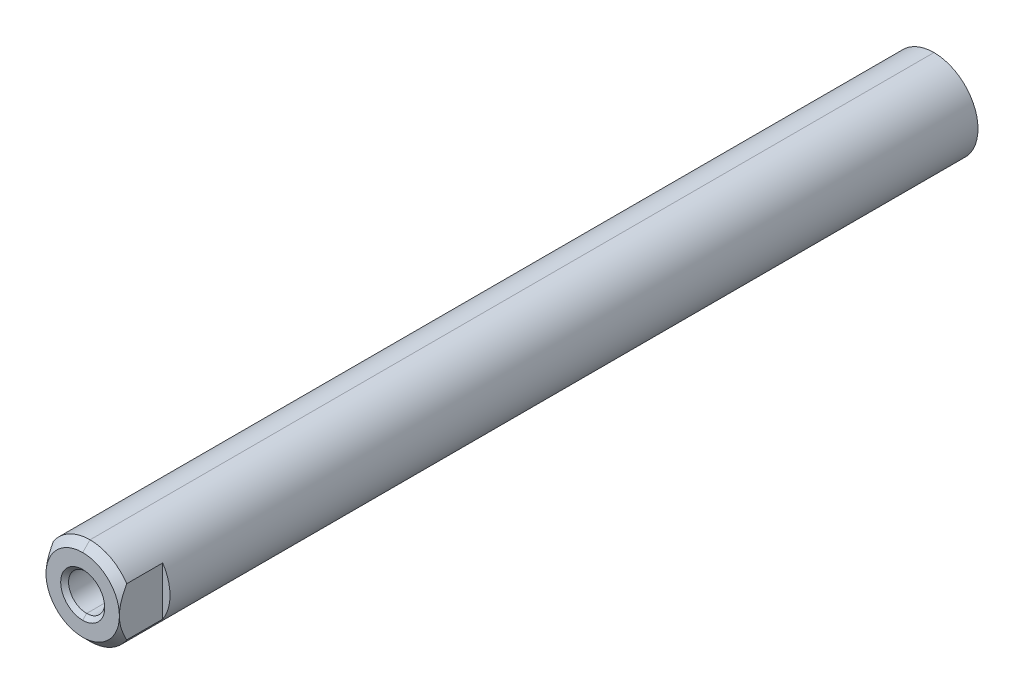
ISO-10303-21;
HEADER;
FILE_DESCRIPTION(('STEP AP214'),'2;1');
FILE_NAME('part.step','',(''),(''),'','','');
FILE_SCHEMA(('AUTOMOTIVE_DESIGN { 1 0 10303 214 1 1 1 1 }'));
ENDSEC;
DATA;
#1=APPLICATION_CONTEXT('core data for automotive mechanical design processes');
#2=APPLICATION_PROTOCOL_DEFINITION('international standard','automotive_design',2000,#1);
#3=PRODUCT_CONTEXT('',#1,'mechanical');
#4=PRODUCT('Part','Part','',(#3));
#5=PRODUCT_RELATED_PRODUCT_CATEGORY('part','',(#4));
#6=PRODUCT_DEFINITION_FORMATION('','',#4);
#7=PRODUCT_DEFINITION_CONTEXT('part definition',#1,'design');
#8=PRODUCT_DEFINITION('design','',#6,#7);
#9=PRODUCT_DEFINITION_SHAPE('','',#8);
#10=(LENGTH_UNIT() NAMED_UNIT(*) SI_UNIT(.MILLI.,.METRE.));
#11=(NAMED_UNIT(*) PLANE_ANGLE_UNIT() SI_UNIT($,.RADIAN.));
#12=(NAMED_UNIT(*) SI_UNIT($,.STERADIAN.) SOLID_ANGLE_UNIT());
#13=UNCERTAINTY_MEASURE_WITH_UNIT(LENGTH_MEASURE(1.E-05),#10,'distance_accuracy_value','');
#14=(GEOMETRIC_REPRESENTATION_CONTEXT(3) GLOBAL_UNCERTAINTY_ASSIGNED_CONTEXT((#13)) GLOBAL_UNIT_ASSIGNED_CONTEXT((#10,
#11,#12)) REPRESENTATION_CONTEXT('',''));
#15=CARTESIAN_POINT('',(0.,0.,0.));
#16=DIRECTION('',(0.,0.,1.));
#17=DIRECTION('',(1.,0.,0.));
#18=AXIS2_PLACEMENT_3D('',#15,#16,#17);
#19=CARTESIAN_POINT('',(0.,2.5,6.));
#20=DIRECTION('',(0.,0.,1.));
#21=DIRECTION('',(1.,0.,0.));
#22=AXIS2_PLACEMENT_3D('',#19,#20,#21);
#23=PLANE('',#22);
#24=CARTESIAN_POINT('',(0.,0.,6.));
#25=DIRECTION('',(0.,0.,-1.));
#26=DIRECTION('',(0.,1.,0.));
#27=AXIS2_PLACEMENT_3D('',#24,#25,#26);
#28=CIRCLE('',#27,3.);
#29=CARTESIAN_POINT('',(0.,-3.,6.));
#30=VERTEX_POINT('',#29);
#31=CARTESIAN_POINT('',(0.,3.,6.));
#32=VERTEX_POINT('',#31);
#33=EDGE_CURVE('E103',#30,#32,#28,.T.);
#34=ORIENTED_EDGE('',*,*,#33,.T.);
#35=CARTESIAN_POINT('',(0.,0.,6.));
#36=DIRECTION('',(0.,0.,-1.));
#37=DIRECTION('',(0.,1.,0.));
#38=AXIS2_PLACEMENT_3D('',#35,#36,#37);
#39=CIRCLE('',#38,3.);
#40=EDGE_CURVE('E100',#32,#30,#39,.T.);
#41=ORIENTED_EDGE('',*,*,#40,.T.);
#42=EDGE_LOOP('',(#34,#41));
#43=FACE_BOUND('',#42,.T.);
#44=CARTESIAN_POINT('',(0.,0.,6.));
#45=DIRECTION('',(0.,0.,1.));
#46=DIRECTION('',(0.,1.,0.));
#47=AXIS2_PLACEMENT_3D('',#44,#45,#46);
#48=CIRCLE('',#47,5.);
#49=CARTESIAN_POINT('',(5.,0.,6.));
#50=VERTEX_POINT('',#49);
#51=CARTESIAN_POINT('',(0.,5.,6.));
#52=VERTEX_POINT('',#51);
#53=EDGE_CURVE('E252',#50,#52,#48,.T.);
#54=ORIENTED_EDGE('',*,*,#53,.T.);
#55=CARTESIAN_POINT('',(0.,0.,6.));
#56=DIRECTION('',(0.,0.,1.));
#57=DIRECTION('',(0.,1.,0.));
#58=AXIS2_PLACEMENT_3D('',#55,#56,#57);
#59=CIRCLE('',#58,5.);
#60=CARTESIAN_POINT('',(-5.,0.,6.));
#61=VERTEX_POINT('',#60);
#62=EDGE_CURVE('E129',#52,#61,#59,.T.);
#63=ORIENTED_EDGE('',*,*,#62,.T.);
#64=CARTESIAN_POINT('',(0.,0.,6.));
#65=DIRECTION('',(0.,0.,1.));
#66=DIRECTION('',(0.,1.,0.));
#67=AXIS2_PLACEMENT_3D('',#64,#65,#66);
#68=CIRCLE('',#67,5.);
#69=CARTESIAN_POINT('',(0.,-5.,6.));
#70=VERTEX_POINT('',#69);
#71=EDGE_CURVE('E134',#61,#70,#68,.T.);
#72=ORIENTED_EDGE('',*,*,#71,.T.);
#73=CARTESIAN_POINT('',(0.,0.,6.));
#74=DIRECTION('',(0.,0.,1.));
#75=DIRECTION('',(0.,1.,0.));
#76=AXIS2_PLACEMENT_3D('',#73,#74,#75);
#77=CIRCLE('',#76,5.);
#78=EDGE_CURVE('E10',#70,#50,#77,.T.);
#79=ORIENTED_EDGE('',*,*,#78,.T.);
#80=EDGE_LOOP('',(#54,#63,#72,#79));
#81=FACE_BOUND('',#80,.T.);
#82=ADVANCED_FACE('F15',(#43,#81),#23,.T.);
#83=CARTESIAN_POINT('',(0.,0.,5.5));
#84=DIRECTION('',(0.,0.,-1.));
#85=DIRECTION('',(0.,1.,0.));
#86=AXIS2_PLACEMENT_3D('',#83,#84,#85);
#87=CONICAL_SURFACE('',#86,5.5,0.785398163397448);
#88=DIRECTION('',(0.,-0.707106781186548,-0.707106781186548));
#89=VECTOR('',#88,1.);
#90=CARTESIAN_POINT('',(0.,-5.5,5.5));
#91=LINE('',#90,#89);
#92=CARTESIAN_POINT('',(0.,-6.,5.));
#93=VERTEX_POINT('',#92);
#94=EDGE_CURVE('E132',#70,#93,#91,.T.);
#95=ORIENTED_EDGE('',*,*,#94,.T.);
#96=CARTESIAN_POINT('',(0.,0.,5.));
#97=DIRECTION('',(0.,0.,1.));
#98=DIRECTION('',(0.,1.,0.));
#99=AXIS2_PLACEMENT_3D('',#96,#97,#98);
#100=CIRCLE('',#99,6.);
#101=CARTESIAN_POINT('',(5.,-3.3166247903554,5.));
#102=VERTEX_POINT('',#101);
#103=EDGE_CURVE('E31',#93,#102,#100,.T.);
#104=ORIENTED_EDGE('',*,*,#103,.T.);
#105=CARTESIAN_POINT('',(5.,-3.3166247903554,5.));
#106=CARTESIAN_POINT('',(5.,-1.50755672288882,6.));
#107=CARTESIAN_POINT('',(5.,0.,6.));
#108=(BOUNDED_CURVE() B_SPLINE_CURVE(2,(#105,#106,#107),.UNSPECIFIED.,.F.,
.F.) B_SPLINE_CURVE_WITH_KNOTS((3,3),(0.,3.49284368213993),
.UNSPECIFIED.) CURVE() GEOMETRIC_REPRESENTATION_ITEM() RATIONAL_B_SPLINE_CURVE((1.,
1.04880884817015,1.)) REPRESENTATION_ITEM(''));
#109=EDGE_CURVE('E238',#102,#50,#108,.T.);
#110=ORIENTED_EDGE('',*,*,#109,.T.);
#111=ORIENTED_EDGE('',*,*,#78,.F.);
#112=EDGE_LOOP('',(#95,#104,#110,#111));
#113=FACE_BOUND('',#112,.T.);
#114=ADVANCED_FACE('F305',(#113),#87,.T.);
#115=CARTESIAN_POINT('',(0.,3.,-110.));
#116=DIRECTION('',(0.,0.,-1.));
#117=DIRECTION('',(0.,-1.,0.));
#118=AXIS2_PLACEMENT_3D('',#115,#116,#117);
#119=PLANE('',#118);
#120=CARTESIAN_POINT('',(0.,0.,-110.));
#121=DIRECTION('',(0.,0.,1.));
#122=DIRECTION('',(0.,1.,0.));
#123=AXIS2_PLACEMENT_3D('',#120,#121,#122);
#124=CIRCLE('',#123,6.);
#125=CARTESIAN_POINT('',(0.,6.,-110.));
#126=VERTEX_POINT('',#125);
#127=CARTESIAN_POINT('',(0.,-6.,-110.));
#128=VERTEX_POINT('',#127);
#129=EDGE_CURVE('E169',#126,#128,#124,.T.);
#130=ORIENTED_EDGE('',*,*,#129,.F.);
#131=CARTESIAN_POINT('',(0.,0.,-110.));
#132=DIRECTION('',(0.,0.,1.));
#133=DIRECTION('',(0.,1.,0.));
#134=AXIS2_PLACEMENT_3D('',#131,#132,#133);
#135=CIRCLE('',#134,6.);
#136=EDGE_CURVE('E18',#128,#126,#135,.T.);
#137=ORIENTED_EDGE('',*,*,#136,.F.);
#138=EDGE_LOOP('',(#130,#137));
#139=FACE_BOUND('',#138,.T.);
#140=ADVANCED_FACE('F269',(#139),#119,.T.);
#141=CARTESIAN_POINT('',(0.,0.,-52.5));
#142=DIRECTION('',(0.,0.,-1.));
#143=DIRECTION('',(0.,1.,0.));
#144=AXIS2_PLACEMENT_3D('',#141,#142,#143);
#145=CYLINDRICAL_SURFACE('',#144,6.);
#146=DIRECTION('',(0.,0.,1.));
#147=VECTOR('',#146,1.);
#148=CARTESIAN_POINT('',(0.,6.,-52.5));
#149=LINE('',#148,#147);
#150=CARTESIAN_POINT('',(0.,6.,5.));
#151=VERTEX_POINT('',#150);
#152=EDGE_CURVE('E159',#126,#151,#149,.T.);
#153=ORIENTED_EDGE('',*,*,#152,.T.);
#154=CARTESIAN_POINT('',(0.,0.,5.));
#155=DIRECTION('',(0.,0.,1.));
#156=DIRECTION('',(0.,1.,0.));
#157=AXIS2_PLACEMENT_3D('',#154,#155,#156);
#158=CIRCLE('',#157,6.);
#159=CARTESIAN_POINT('',(5.,3.3166247903554,5.));
#160=VERTEX_POINT('',#159);
#161=EDGE_CURVE('E255',#160,#151,#158,.T.);
#162=ORIENTED_EDGE('',*,*,#161,.F.);
#163=DIRECTION('',(0.,0.,-1.));
#164=VECTOR('',#163,1.);
#165=CARTESIAN_POINT('',(5.,3.31662479035541,2.55));
#166=LINE('',#165,#164);
#167=CARTESIAN_POINT('',(5.,3.31662479035541,0.1));
#168=VERTEX_POINT('',#167);
#169=EDGE_CURVE('E229',#160,#168,#166,.T.);
#170=ORIENTED_EDGE('',*,*,#169,.T.);
#171=CARTESIAN_POINT('',(0.,0.,0.1));
#172=DIRECTION('',(0.,0.,-1.));
#173=DIRECTION('',(0.,1.,0.));
#174=AXIS2_PLACEMENT_3D('',#171,#172,#173);
#175=CIRCLE('',#174,6.);
#176=CARTESIAN_POINT('',(5.,-3.31662479035541,0.1));
#177=VERTEX_POINT('',#176);
#178=EDGE_CURVE('E108',#168,#177,#175,.T.);
#179=ORIENTED_EDGE('',*,*,#178,.T.);
#180=DIRECTION('',(0.,0.,1.));
#181=VECTOR('',#180,1.);
#182=CARTESIAN_POINT('',(5.,-3.31662479035541,2.55));
#183=LINE('',#182,#181);
#184=EDGE_CURVE('E246',#177,#102,#183,.T.);
#185=ORIENTED_EDGE('',*,*,#184,.T.);
#186=ORIENTED_EDGE('',*,*,#103,.F.);
#187=DIRECTION('',(0.,0.,-1.));
#188=VECTOR('',#187,1.);
#189=CARTESIAN_POINT('',(0.,-6.,-52.5));
#190=LINE('',#189,#188);
#191=EDGE_CURVE('E172',#93,#128,#190,.T.);
#192=ORIENTED_EDGE('',*,*,#191,.T.);
#193=ORIENTED_EDGE('',*,*,#136,.T.);
#194=EDGE_LOOP('',(#153,#162,#170,#179,#185,#186,#192,#193));
#195=FACE_BOUND('',#194,.T.);
#196=ADVANCED_FACE('F265',(#195),#145,.T.);
#197=CARTESIAN_POINT('',(0.,0.,5.5));
#198=DIRECTION('',(0.,0.,-1.));
#199=DIRECTION('',(0.,1.,0.));
#200=AXIS2_PLACEMENT_3D('',#197,#198,#199);
#201=CONICAL_SURFACE('',#200,5.5,0.785398163397448);
#202=DIRECTION('',(0.,-0.707106781186548,0.707106781186548));
#203=VECTOR('',#202,1.);
#204=CARTESIAN_POINT('',(0.,5.5,5.5));
#205=LINE('',#204,#203);
#206=EDGE_CURVE('E190',#151,#52,#205,.T.);
#207=ORIENTED_EDGE('',*,*,#206,.T.);
#208=ORIENTED_EDGE('',*,*,#53,.F.);
#209=CARTESIAN_POINT('',(5.,0.,6.));
#210=CARTESIAN_POINT('',(5.,1.50755672288882,6.));
#211=CARTESIAN_POINT('',(5.,3.3166247903554,5.));
#212=(BOUNDED_CURVE() B_SPLINE_CURVE(2,(#209,#210,#211),.UNSPECIFIED.,.F.,
.F.) B_SPLINE_CURVE_WITH_KNOTS((3,3),(3.49284368213993,6.98568736427985),
.UNSPECIFIED.) CURVE() GEOMETRIC_REPRESENTATION_ITEM() RATIONAL_B_SPLINE_CURVE((1.,
1.04880884817015,1.)) REPRESENTATION_ITEM(''));
#213=EDGE_CURVE('E232',#50,#160,#212,.T.);
#214=ORIENTED_EDGE('',*,*,#213,.T.);
#215=ORIENTED_EDGE('',*,*,#161,.T.);
#216=EDGE_LOOP('',(#207,#208,#214,#215));
#217=FACE_BOUND('',#216,.T.);
#218=ADVANCED_FACE('F280',(#217),#201,.T.);
#219=CARTESIAN_POINT('',(5.,8.,11.9));
#220=DIRECTION('',(-1.,0.,0.));
#221=DIRECTION('',(0.,0.,1.));
#222=AXIS2_PLACEMENT_3D('',#219,#220,#221);
#223=PLANE('',#222);
#224=ORIENTED_EDGE('',*,*,#169,.F.);
#225=ORIENTED_EDGE('',*,*,#213,.F.);
#226=ORIENTED_EDGE('',*,*,#109,.F.);
#227=ORIENTED_EDGE('',*,*,#184,.F.);
#228=DIRECTION('',(0.,-1.,0.));
#229=VECTOR('',#228,1.);
#230=CARTESIAN_POINT('',(5.,8.,0.1));
#231=LINE('',#230,#229);
#232=EDGE_CURVE('E222',#168,#177,#231,.T.);
#233=ORIENTED_EDGE('',*,*,#232,.F.);
#234=EDGE_LOOP('',(#224,#225,#226,#227,#233));
#235=FACE_BOUND('',#234,.T.);
#236=ADVANCED_FACE('F286',(#235),#223,.F.);
#237=CARTESIAN_POINT('',(-5.,-6.9,11.9));
#238=DIRECTION('',(1.,0.,0.));
#239=DIRECTION('',(0.,1.,0.));
#240=AXIS2_PLACEMENT_3D('',#237,#238,#239);
#241=PLANE('',#240);
#242=DIRECTION('',(0.,0.,-1.));
#243=VECTOR('',#242,1.);
#244=CARTESIAN_POINT('',(-5.,-3.31662479035541,2.55));
#245=LINE('',#244,#243);
#246=CARTESIAN_POINT('',(-5.,-3.3166247903554,5.));
#247=VERTEX_POINT('',#246);
#248=CARTESIAN_POINT('',(-5.,-3.31662479035541,0.1));
#249=VERTEX_POINT('',#248);
#250=EDGE_CURVE('E165',#247,#249,#245,.T.);
#251=ORIENTED_EDGE('',*,*,#250,.F.);
#252=CARTESIAN_POINT('',(-5.,0.,6.));
#253=CARTESIAN_POINT('',(-5.,-1.50755672288882,6.));
#254=CARTESIAN_POINT('',(-5.,-3.3166247903554,5.));
#255=(BOUNDED_CURVE() B_SPLINE_CURVE(2,(#252,#253,#254),.UNSPECIFIED.,.F.,
.F.) B_SPLINE_CURVE_WITH_KNOTS((3,3),(3.49284368213993,6.98568736427985),
.UNSPECIFIED.) CURVE() GEOMETRIC_REPRESENTATION_ITEM() RATIONAL_B_SPLINE_CURVE((1.,
1.04880884817015,1.)) REPRESENTATION_ITEM(''));
#256=EDGE_CURVE('E137',#61,#247,#255,.T.);
#257=ORIENTED_EDGE('',*,*,#256,.F.);
#258=CARTESIAN_POINT('',(-5.,3.3166247903554,5.));
#259=CARTESIAN_POINT('',(-5.,1.50755672288882,6.));
#260=CARTESIAN_POINT('',(-5.,0.,6.));
#261=(BOUNDED_CURVE() B_SPLINE_CURVE(2,(#258,#259,#260),.UNSPECIFIED.,.F.,
.F.) B_SPLINE_CURVE_WITH_KNOTS((3,3),(0.,3.49284368213993),
.UNSPECIFIED.) CURVE() GEOMETRIC_REPRESENTATION_ITEM() RATIONAL_B_SPLINE_CURVE((1.,
1.04880884817015,1.)) REPRESENTATION_ITEM(''));
#262=CARTESIAN_POINT('',(-5.,3.3166247903554,5.));
#263=VERTEX_POINT('',#262);
#264=EDGE_CURVE('E182',#263,#61,#261,.T.);
#265=ORIENTED_EDGE('',*,*,#264,.F.);
#266=DIRECTION('',(0.,0.,1.));
#267=VECTOR('',#266,1.);
#268=CARTESIAN_POINT('',(-5.,3.31662479035541,2.55));
#269=LINE('',#268,#267);
#270=CARTESIAN_POINT('',(-5.,3.31662479035541,0.1));
#271=VERTEX_POINT('',#270);
#272=EDGE_CURVE('E164',#271,#263,#269,.T.);
#273=ORIENTED_EDGE('',*,*,#272,.F.);
#274=DIRECTION('',(0.,1.,0.));
#275=VECTOR('',#274,1.);
#276=CARTESIAN_POINT('',(-5.,-6.9,0.1));
#277=LINE('',#276,#275);
#278=EDGE_CURVE('E226',#249,#271,#277,.T.);
#279=ORIENTED_EDGE('',*,*,#278,.F.);
#280=EDGE_LOOP('',(#251,#257,#265,#273,#279));
#281=FACE_BOUND('',#280,.T.);
#282=ADVANCED_FACE('F300',(#281),#241,.F.);
#283=CARTESIAN_POINT('',(0.,0.,0.1));
#284=DIRECTION('',(0.,0.,1.));
#285=DIRECTION('',(1.,0.,0.));
#286=AXIS2_PLACEMENT_3D('',#283,#284,#285);
#287=PLANE('',#286);
#288=CARTESIAN_POINT('',(0.,0.,0.1));
#289=DIRECTION('',(0.,0.,-1.));
#290=DIRECTION('',(0.,1.,0.));
#291=AXIS2_PLACEMENT_3D('',#288,#289,#290);
#292=CIRCLE('',#291,6.);
#293=EDGE_CURVE('E160',#249,#271,#292,.T.);
#294=ORIENTED_EDGE('',*,*,#293,.F.);
#295=ORIENTED_EDGE('',*,*,#278,.T.);
#296=EDGE_LOOP('',(#294,#295));
#297=FACE_BOUND('',#296,.T.);
#298=ADVANCED_FACE('F291',(#297),#287,.T.);
#299=CARTESIAN_POINT('',(0.,0.,0.1));
#300=DIRECTION('',(0.,0.,1.));
#301=DIRECTION('',(1.,0.,0.));
#302=AXIS2_PLACEMENT_3D('',#299,#300,#301);
#303=PLANE('',#302);
#304=ORIENTED_EDGE('',*,*,#178,.F.);
#305=ORIENTED_EDGE('',*,*,#232,.T.);
#306=EDGE_LOOP('',(#304,#305));
#307=FACE_BOUND('',#306,.T.);
#308=ADVANCED_FACE('F289',(#307),#303,.T.);
#309=CARTESIAN_POINT('',(0.,0.,5.98));
#310=DIRECTION('',(0.,0.,1.));
#311=DIRECTION('',(0.,1.,0.));
#312=AXIS2_PLACEMENT_3D('',#309,#310,#311);
#313=CONICAL_SURFACE('',#312,2.98,0.785398163397452);
#314=DIRECTION('',(0.,-0.70710678118655,-0.707106781186545));
#315=VECTOR('',#314,1.);
#316=CARTESIAN_POINT('',(0.,2.98,5.98));
#317=LINE('',#316,#315);
#318=CARTESIAN_POINT('',(0.,2.46,5.46));
#319=VERTEX_POINT('',#318);
#320=EDGE_CURVE('E121',#32,#319,#317,.T.);
#321=ORIENTED_EDGE('',*,*,#320,.T.);
#322=CARTESIAN_POINT('',(0.,0.,5.46));
#323=DIRECTION('',(0.,0.,1.));
#324=DIRECTION('',(0.,1.,0.));
#325=AXIS2_PLACEMENT_3D('',#322,#323,#324);
#326=CIRCLE('',#325,2.46);
#327=CARTESIAN_POINT('',(0.,-2.46,5.46));
#328=VERTEX_POINT('',#327);
#329=EDGE_CURVE('E109',#328,#319,#326,.T.);
#330=ORIENTED_EDGE('',*,*,#329,.F.);
#331=DIRECTION('',(0.,-0.70710678118655,0.707106781186545));
#332=VECTOR('',#331,1.);
#333=CARTESIAN_POINT('',(0.,-2.98,5.98));
#334=LINE('',#333,#332);
#335=EDGE_CURVE('E112',#328,#30,#334,.T.);
#336=ORIENTED_EDGE('',*,*,#335,.T.);
#337=ORIENTED_EDGE('',*,*,#40,.F.);
#338=EDGE_LOOP('',(#321,#330,#336,#337));
#339=FACE_BOUND('',#338,.T.);
#340=ADVANCED_FACE('F113',(#339),#313,.F.);
#341=CARTESIAN_POINT('',(0.,0.,0.48));
#342=DIRECTION('',(0.,0.,-1.));
#343=DIRECTION('',(0.,1.,0.));
#344=AXIS2_PLACEMENT_3D('',#341,#342,#343);
#345=CYLINDRICAL_SURFACE('',#344,2.46);
#346=DIRECTION('',(0.,0.,-1.));
#347=VECTOR('',#346,1.);
#348=CARTESIAN_POINT('',(0.,2.46,0.48));
#349=LINE('',#348,#347);
#350=CARTESIAN_POINT('',(0.,2.46,-4.5));
#351=VERTEX_POINT('',#350);
#352=EDGE_CURVE('E205',#319,#351,#349,.T.);
#353=ORIENTED_EDGE('',*,*,#352,.T.);
#354=CARTESIAN_POINT('',(0.,0.,-4.5));
#355=DIRECTION('',(0.,0.,1.));
#356=DIRECTION('',(0.,1.,0.));
#357=AXIS2_PLACEMENT_3D('',#354,#355,#356);
#358=CIRCLE('',#357,2.46);
#359=CARTESIAN_POINT('',(0.,-2.46,-4.5));
#360=VERTEX_POINT('',#359);
#361=EDGE_CURVE('E155',#360,#351,#358,.T.);
#362=ORIENTED_EDGE('',*,*,#361,.F.);
#363=DIRECTION('',(0.,0.,1.));
#364=VECTOR('',#363,1.);
#365=CARTESIAN_POINT('',(0.,-2.46,0.48));
#366=LINE('',#365,#364);
#367=EDGE_CURVE('E209',#360,#328,#366,.T.);
#368=ORIENTED_EDGE('',*,*,#367,.T.);
#369=ORIENTED_EDGE('',*,*,#329,.T.);
#370=EDGE_LOOP('',(#353,#362,#368,#369));
#371=FACE_BOUND('',#370,.T.);
#372=ADVANCED_FACE('F298',(#371),#345,.F.);
#373=CARTESIAN_POINT('',(0.,0.,-5.21014083110323));
#374=DIRECTION('',(0.,0.,1.));
#375=DIRECTION('',(0.,1.,0.));
#376=AXIS2_PLACEMENT_3D('',#373,#374,#375);
#377=CONICAL_SURFACE('',#376,1.23,1.0471975511966);
#378=DIRECTION('',(0.,-0.866025403784441,0.5));
#379=VECTOR('',#378,1.);
#380=CARTESIAN_POINT('',(0.,-1.23,-5.21014083110323));
#381=LINE('',#380,#379);
#382=CARTESIAN_POINT('',(0.,0.,-5.92028166220646));
#383=VERTEX_POINT('',#382);
#384=EDGE_CURVE('E138',#383,#360,#381,.T.);
#385=ORIENTED_EDGE('',*,*,#384,.T.);
#386=ORIENTED_EDGE('',*,*,#361,.T.);
#387=DIRECTION('',(0.,-0.866025403784441,-0.5));
#388=VECTOR('',#387,1.);
#389=CARTESIAN_POINT('',(0.,1.23,-5.21014083110323));
#390=LINE('',#389,#388);
#391=EDGE_CURVE('E142',#351,#383,#390,.T.);
#392=ORIENTED_EDGE('',*,*,#391,.T.);
#393=EDGE_LOOP('',(#385,#386,#392));
#394=FACE_BOUND('',#393,.T.);
#395=ADVANCED_FACE('F331',(#394),#377,.F.);
#396=CARTESIAN_POINT('',(0.,0.,-5.21014083110323));
#397=DIRECTION('',(0.,0.,1.));
#398=DIRECTION('',(0.,1.,0.));
#399=AXIS2_PLACEMENT_3D('',#396,#397,#398);
#400=CONICAL_SURFACE('',#399,1.23,1.0471975511966);
#401=ORIENTED_EDGE('',*,*,#384,.F.);
#402=ORIENTED_EDGE('',*,*,#391,.F.);
#403=CARTESIAN_POINT('',(0.,0.,-4.5));
#404=DIRECTION('',(0.,0.,1.));
#405=DIRECTION('',(0.,1.,0.));
#406=AXIS2_PLACEMENT_3D('',#403,#404,#405);
#407=CIRCLE('',#406,2.46);
#408=EDGE_CURVE('E143',#351,#360,#407,.T.);
#409=ORIENTED_EDGE('',*,*,#408,.T.);
#410=EDGE_LOOP('',(#401,#402,#409));
#411=FACE_BOUND('',#410,.T.);
#412=ADVANCED_FACE('F328',(#411),#400,.F.);
#413=CARTESIAN_POINT('',(0.,0.,0.48));
#414=DIRECTION('',(0.,0.,-1.));
#415=DIRECTION('',(0.,1.,0.));
#416=AXIS2_PLACEMENT_3D('',#413,#414,#415);
#417=CYLINDRICAL_SURFACE('',#416,2.46);
#418=ORIENTED_EDGE('',*,*,#352,.F.);
#419=CARTESIAN_POINT('',(0.,0.,5.46));
#420=DIRECTION('',(0.,0.,1.));
#421=DIRECTION('',(0.,1.,0.));
#422=AXIS2_PLACEMENT_3D('',#419,#420,#421);
#423=CIRCLE('',#422,2.46);
#424=EDGE_CURVE('E118',#319,#328,#423,.T.);
#425=ORIENTED_EDGE('',*,*,#424,.T.);
#426=ORIENTED_EDGE('',*,*,#367,.F.);
#427=ORIENTED_EDGE('',*,*,#408,.F.);
#428=EDGE_LOOP('',(#418,#425,#426,#427));
#429=FACE_BOUND('',#428,.T.);
#430=ADVANCED_FACE('F325',(#429),#417,.F.);
#431=CARTESIAN_POINT('',(0.,0.,5.98));
#432=DIRECTION('',(0.,0.,1.));
#433=DIRECTION('',(0.,1.,0.));
#434=AXIS2_PLACEMENT_3D('',#431,#432,#433);
#435=CONICAL_SURFACE('',#434,2.98,0.785398163397452);
#436=ORIENTED_EDGE('',*,*,#320,.F.);
#437=ORIENTED_EDGE('',*,*,#33,.F.);
#438=ORIENTED_EDGE('',*,*,#335,.F.);
#439=ORIENTED_EDGE('',*,*,#424,.F.);
#440=EDGE_LOOP('',(#436,#437,#438,#439));
#441=FACE_BOUND('',#440,.T.);
#442=ADVANCED_FACE('F120',(#441),#435,.F.);
#443=CARTESIAN_POINT('',(0.,0.,5.5));
#444=DIRECTION('',(0.,0.,-1.));
#445=DIRECTION('',(0.,1.,0.));
#446=AXIS2_PLACEMENT_3D('',#443,#444,#445);
#447=CONICAL_SURFACE('',#446,5.5,0.785398163397448);
#448=ORIENTED_EDGE('',*,*,#206,.F.);
#449=CARTESIAN_POINT('',(0.,0.,5.));
#450=DIRECTION('',(0.,0.,1.));
#451=DIRECTION('',(0.,1.,0.));
#452=AXIS2_PLACEMENT_3D('',#449,#450,#451);
#453=CIRCLE('',#452,6.);
#454=EDGE_CURVE('E186',#151,#263,#453,.T.);
#455=ORIENTED_EDGE('',*,*,#454,.T.);
#456=ORIENTED_EDGE('',*,*,#264,.T.);
#457=ORIENTED_EDGE('',*,*,#62,.F.);
#458=EDGE_LOOP('',(#448,#455,#456,#457));
#459=FACE_BOUND('',#458,.T.);
#460=ADVANCED_FACE('F276',(#459),#447,.T.);
#461=CARTESIAN_POINT('',(0.,0.,-52.5));
#462=DIRECTION('',(0.,0.,-1.));
#463=DIRECTION('',(0.,1.,0.));
#464=AXIS2_PLACEMENT_3D('',#461,#462,#463);
#465=CYLINDRICAL_SURFACE('',#464,6.);
#466=ORIENTED_EDGE('',*,*,#152,.F.);
#467=ORIENTED_EDGE('',*,*,#129,.T.);
#468=ORIENTED_EDGE('',*,*,#191,.F.);
#469=CARTESIAN_POINT('',(0.,0.,5.));
#470=DIRECTION('',(0.,0.,1.));
#471=DIRECTION('',(0.,1.,0.));
#472=AXIS2_PLACEMENT_3D('',#469,#470,#471);
#473=CIRCLE('',#472,6.);
#474=EDGE_CURVE('E149',#247,#93,#473,.T.);
#475=ORIENTED_EDGE('',*,*,#474,.F.);
#476=ORIENTED_EDGE('',*,*,#250,.T.);
#477=ORIENTED_EDGE('',*,*,#293,.T.);
#478=ORIENTED_EDGE('',*,*,#272,.T.);
#479=ORIENTED_EDGE('',*,*,#454,.F.);
#480=EDGE_LOOP('',(#466,#467,#468,#475,#476,#477,#478,#479));
#481=FACE_BOUND('',#480,.T.);
#482=ADVANCED_FACE('F272',(#481),#465,.T.);
#483=CARTESIAN_POINT('',(0.,0.,5.5));
#484=DIRECTION('',(0.,0.,-1.));
#485=DIRECTION('',(0.,1.,0.));
#486=AXIS2_PLACEMENT_3D('',#483,#484,#485);
#487=CONICAL_SURFACE('',#486,5.5,0.785398163397448);
#488=ORIENTED_EDGE('',*,*,#94,.F.);
#489=ORIENTED_EDGE('',*,*,#71,.F.);
#490=ORIENTED_EDGE('',*,*,#256,.T.);
#491=ORIENTED_EDGE('',*,*,#474,.T.);
#492=EDGE_LOOP('',(#488,#489,#490,#491));
#493=FACE_BOUND('',#492,.T.);
#494=ADVANCED_FACE('F378',(#493),#487,.T.);
#495=CLOSED_SHELL('',(#82,#114,#140,#196,#218,#236,#282,#298,#308,#340,#372,#395,#412,#430,#442,
#460,#482,#494));
#496=MANIFOLD_SOLID_BREP('B1',#495);
#497=ADVANCED_BREP_SHAPE_REPRESENTATION('',(#18,#496),#14);
#498=SHAPE_DEFINITION_REPRESENTATION(#9,#497);
ENDSEC;
END-ISO-10303-21;
